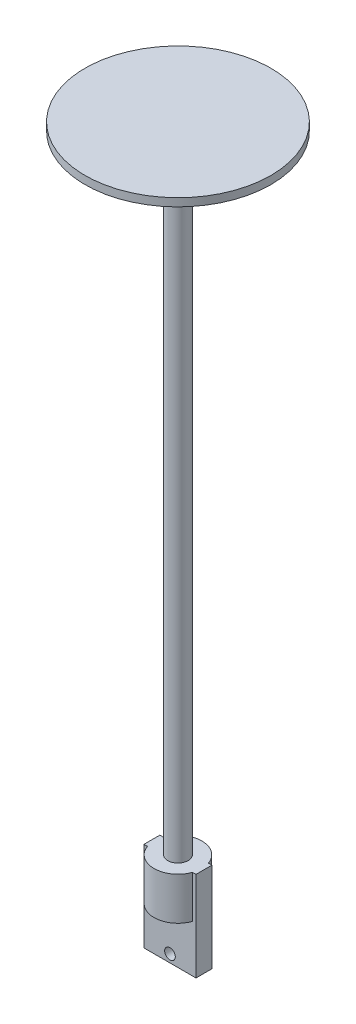
ISO-10303-21;
HEADER;
FILE_DESCRIPTION(('STEP AP214'),'2;1');
FILE_NAME('part.step','',(''),(''),'','','');
FILE_SCHEMA(('AUTOMOTIVE_DESIGN { 1 0 10303 214 1 1 1 1 }'));
ENDSEC;
DATA;
#1=APPLICATION_CONTEXT('core data for automotive mechanical design processes');
#2=APPLICATION_PROTOCOL_DEFINITION('international standard','automotive_design',2000,#1);
#3=PRODUCT_CONTEXT('',#1,'mechanical');
#4=PRODUCT('Part','Part','',(#3));
#5=PRODUCT_RELATED_PRODUCT_CATEGORY('part','',(#4));
#6=PRODUCT_DEFINITION_FORMATION('','',#4);
#7=PRODUCT_DEFINITION_CONTEXT('part definition',#1,'design');
#8=PRODUCT_DEFINITION('design','',#6,#7);
#9=PRODUCT_DEFINITION_SHAPE('','',#8);
#10=(LENGTH_UNIT() NAMED_UNIT(*) SI_UNIT(.MILLI.,.METRE.));
#11=(NAMED_UNIT(*) PLANE_ANGLE_UNIT() SI_UNIT($,.RADIAN.));
#12=(NAMED_UNIT(*) SI_UNIT($,.STERADIAN.) SOLID_ANGLE_UNIT());
#13=UNCERTAINTY_MEASURE_WITH_UNIT(LENGTH_MEASURE(1.E-05),#10,'distance_accuracy_value','');
#14=(GEOMETRIC_REPRESENTATION_CONTEXT(3) GLOBAL_UNCERTAINTY_ASSIGNED_CONTEXT((#13)) GLOBAL_UNIT_ASSIGNED_CONTEXT((#10,
#11,#12)) REPRESENTATION_CONTEXT('',''));
#15=CARTESIAN_POINT('',(0.,0.,0.));
#16=DIRECTION('',(0.,0.,1.));
#17=DIRECTION('',(1.,0.,0.));
#18=AXIS2_PLACEMENT_3D('',#15,#16,#17);
#19=CARTESIAN_POINT('',(0.,130.45,1.5));
#20=DIRECTION('',(0.,-1.,0.));
#21=DIRECTION('',(0.,0.,-1.));
#22=AXIS2_PLACEMENT_3D('',#19,#20,#21);
#23=CYLINDRICAL_SURFACE('',#22,1.925);
#24=CARTESIAN_POINT('',(0.,122.65,1.5));
#25=DIRECTION('',(0.,-1.,0.));
#26=DIRECTION('',(1.,0.,0.));
#27=AXIS2_PLACEMENT_3D('',#24,#25,#26);
#28=CIRCLE('',#27,1.925);
#29=CARTESIAN_POINT('',(0.,122.65,-0.425));
#30=VERTEX_POINT('',#29);
#31=EDGE_CURVE('E128',#30,#30,#28,.T.);
#32=CARTESIAN_POINT('',(0.,12.45,1.5));
#33=DIRECTION('',(0.,1.,0.));
#34=DIRECTION('',(0.,0.,1.));
#35=AXIS2_PLACEMENT_3D('',#32,#33,#34);
#36=CIRCLE('',#35,1.925);
#37=CARTESIAN_POINT('',(0.,12.45,-0.425));
#38=VERTEX_POINT('',#37);
#39=EDGE_CURVE('E127',#38,#38,#36,.T.);
#40=CARTESIAN_POINT('',(0.,122.65,-0.425));
#41=CARTESIAN_POINT('',(0.,121.502083333333,-0.425));
#42=CARTESIAN_POINT('',(0.,120.354166666667,-0.425));
#43=CARTESIAN_POINT('',(0.,118.058333333333,-0.425));
#44=CARTESIAN_POINT('',(0.,116.910416666667,-0.425));
#45=CARTESIAN_POINT('',(0.,114.614583333333,-0.425));
#46=CARTESIAN_POINT('',(0.,113.466666666667,-0.425));
#47=CARTESIAN_POINT('',(0.,111.170833333333,-0.425));
#48=CARTESIAN_POINT('',(0.,110.022916666667,-0.425));
#49=CARTESIAN_POINT('',(0.,107.727083333333,-0.425));
#50=CARTESIAN_POINT('',(0.,106.579166666667,-0.425));
#51=CARTESIAN_POINT('',(0.,104.283333333333,-0.425));
#52=CARTESIAN_POINT('',(0.,103.135416666667,-0.425));
#53=CARTESIAN_POINT('',(0.,100.839583333333,-0.425));
#54=CARTESIAN_POINT('',(0.,99.6916666666667,-0.425));
#55=CARTESIAN_POINT('',(0.,97.3958333333333,-0.425));
#56=CARTESIAN_POINT('',(0.,96.2479166666667,-0.425));
#57=CARTESIAN_POINT('',(0.,93.9520833333333,-0.425));
#58=CARTESIAN_POINT('',(0.,92.8041666666667,-0.425));
#59=CARTESIAN_POINT('',(0.,90.5083333333333,-0.425));
#60=CARTESIAN_POINT('',(0.,89.3604166666667,-0.425));
#61=CARTESIAN_POINT('',(0.,87.0645833333333,-0.425));
#62=CARTESIAN_POINT('',(0.,85.9166666666667,-0.425));
#63=CARTESIAN_POINT('',(0.,83.6208333333333,-0.425));
#64=CARTESIAN_POINT('',(0.,82.4729166666667,-0.425));
#65=CARTESIAN_POINT('',(0.,80.1770833333333,-0.425));
#66=CARTESIAN_POINT('',(0.,79.0291666666667,-0.425));
#67=CARTESIAN_POINT('',(0.,76.7333333333333,-0.425));
#68=CARTESIAN_POINT('',(0.,75.5854166666667,-0.425));
#69=CARTESIAN_POINT('',(0.,73.2895833333333,-0.425));
#70=CARTESIAN_POINT('',(0.,72.1416666666667,-0.425));
#71=CARTESIAN_POINT('',(0.,69.8458333333333,-0.425));
#72=CARTESIAN_POINT('',(0.,68.6979166666667,-0.425));
#73=CARTESIAN_POINT('',(0.,66.4020833333334,-0.425));
#74=CARTESIAN_POINT('',(0.,65.2541666666667,-0.425));
#75=CARTESIAN_POINT('',(0.,62.9583333333333,-0.425));
#76=CARTESIAN_POINT('',(0.,61.8104166666667,-0.425));
#77=CARTESIAN_POINT('',(0.,59.5145833333333,-0.425));
#78=CARTESIAN_POINT('',(0.,58.3666666666667,-0.425));
#79=CARTESIAN_POINT('',(0.,56.0708333333333,-0.425));
#80=CARTESIAN_POINT('',(0.,54.9229166666667,-0.425));
#81=CARTESIAN_POINT('',(0.,52.6270833333333,-0.425));
#82=CARTESIAN_POINT('',(0.,51.4791666666667,-0.425));
#83=CARTESIAN_POINT('',(0.,49.1833333333333,-0.425));
#84=CARTESIAN_POINT('',(0.,48.0354166666667,-0.425));
#85=CARTESIAN_POINT('',(0.,45.7395833333333,-0.425));
#86=CARTESIAN_POINT('',(0.,44.5916666666667,-0.425));
#87=CARTESIAN_POINT('',(0.,42.2958333333333,-0.425));
#88=CARTESIAN_POINT('',(0.,41.1479166666667,-0.425));
#89=CARTESIAN_POINT('',(0.,38.8520833333333,-0.425));
#90=CARTESIAN_POINT('',(0.,37.7041666666667,-0.425));
#91=CARTESIAN_POINT('',(0.,35.4083333333333,-0.425));
#92=CARTESIAN_POINT('',(0.,34.2604166666667,-0.425));
#93=CARTESIAN_POINT('',(0.,31.9645833333333,-0.425));
#94=CARTESIAN_POINT('',(0.,30.8166666666667,-0.425));
#95=CARTESIAN_POINT('',(0.,28.5208333333333,-0.425));
#96=CARTESIAN_POINT('',(0.,27.3729166666667,-0.425));
#97=CARTESIAN_POINT('',(0.,25.0770833333333,-0.425));
#98=CARTESIAN_POINT('',(0.,23.9291666666667,-0.425));
#99=CARTESIAN_POINT('',(0.,21.6333333333333,-0.425));
#100=CARTESIAN_POINT('',(0.,20.4854166666667,-0.425));
#101=CARTESIAN_POINT('',(0.,18.1895833333333,-0.425));
#102=CARTESIAN_POINT('',(0.,17.0416666666667,-0.425));
#103=CARTESIAN_POINT('',(0.,14.7458333333333,-0.425));
#104=CARTESIAN_POINT('',(0.,13.5979166666667,-0.425));
#105=CARTESIAN_POINT('',(0.,12.45,-0.425));
#106=B_SPLINE_CURVE_WITH_KNOTS('',3,(#40,#41,#42,#43,#44,#45,#46,#47,#48,#49,#50,#51,#52,#53,
#54,#55,#56,#57,#58,#59,#60,#61,#62,#63,#64,#65,#66,#67,#68,#69,#70,#71,#72,#73,#74,#75,#76,#77,
#78,#79,#80,#81,#82,#83,#84,#85,#86,#87,#88,#89,#90,#91,#92,#93,#94,#95,#96,#97,#98,#99,#100,
#101,#102,#103,#104,#105),.UNSPECIFIED.,.F.,.F.,(4,2,2,2,2,2,2,2,2,2,2,2,2,2,2,2,2,2,2,2,2,2,2,
2,2,2,2,2,2,2,2,2,4),(0.,3.44375,6.88749999999999,10.33125,13.775,17.21875,20.6625,24.10625,
27.55,30.99375,34.4375,37.88125,41.325,44.76875,48.2125,51.65625,55.1,58.54375,61.9875,65.43125,
68.875,72.31875,75.7625,79.20625,82.65,86.09375,89.5375,92.98125,96.425,99.86875,103.3125,
106.75625,110.2),.UNSPECIFIED.);
#107=EDGE_CURVE('BSEAM47',#30,#38,#106,.T.);
#108=ORIENTED_EDGE('',*,*,#31,.T.);
#109=ORIENTED_EDGE('',*,*,#39,.T.);
#110=ORIENTED_EDGE('',*,*,#107,.T.);
#111=ORIENTED_EDGE('',*,*,#107,.F.);
#112=EDGE_LOOP('',(#108,#110,#109,#111));
#113=FACE_BOUND('',#112,.T.);
#114=ADVANCED_FACE('F47',(#113),#23,.T.);
#115=CARTESIAN_POINT('',(0.,123.05,1.5));
#116=DIRECTION('',(0.,1.,0.));
#117=DIRECTION('',(-1.,0.,0.));
#118=AXIS2_PLACEMENT_3D('',#115,#116,#117);
#119=CONICAL_SURFACE('',#118,3.23094010767584,0.5235987755983);
#120=CARTESIAN_POINT('',(0.,129.45,1.5));
#121=DIRECTION('',(0.,-1.,0.));
#122=DIRECTION('',(1.,0.,0.));
#123=AXIS2_PLACEMENT_3D('',#120,#121,#122);
#124=CIRCLE('',#123,6.92598183048947);
#125=CARTESIAN_POINT('',(6.92598183048947,129.45,1.5));
#126=VERTEX_POINT('',#125);
#127=EDGE_CURVE('E132',#126,#126,#124,.T.);
#128=ORIENTED_EDGE('',*,*,#127,.T.);
#129=EDGE_LOOP('',(#128));
#130=FACE_BOUND('',#129,.T.);
#131=CARTESIAN_POINT('',(0.,123.05,1.5));
#132=DIRECTION('',(0.,-1.,0.));
#133=DIRECTION('',(1.,0.,0.));
#134=AXIS2_PLACEMENT_3D('',#131,#132,#133);
#135=CIRCLE('',#134,3.23094010767584);
#136=CARTESIAN_POINT('',(3.23094010767584,123.05,1.5));
#137=VERTEX_POINT('',#136);
#138=EDGE_CURVE('E11',#137,#137,#135,.T.);
#139=ORIENTED_EDGE('',*,*,#138,.F.);
#140=EDGE_LOOP('',(#139));
#141=FACE_BOUND('',#140,.T.);
#142=ADVANCED_FACE('F161',(#130,#141),#119,.T.);
#143=CARTESIAN_POINT('',(0.,128.45,1.5));
#144=DIRECTION('',(0.,-1.,0.));
#145=DIRECTION('',(1.,0.,0.));
#146=AXIS2_PLACEMENT_3D('',#143,#144,#145);
#147=TOROIDAL_SURFACE('',#146,8.65803263805835,2.);
#148=CARTESIAN_POINT('',(0.,130.45,1.5));
#149=DIRECTION('',(0.,-1.,0.));
#150=DIRECTION('',(1.,0.,0.));
#151=AXIS2_PLACEMENT_3D('',#148,#149,#150);
#152=CIRCLE('',#151,8.65803263805836);
#153=CARTESIAN_POINT('',(8.65803263805836,130.45,1.5));
#154=VERTEX_POINT('',#153);
#155=EDGE_CURVE('E131',#154,#154,#152,.T.);
#156=ORIENTED_EDGE('',*,*,#155,.T.);
#157=EDGE_LOOP('',(#156));
#158=FACE_BOUND('',#157,.T.);
#159=ORIENTED_EDGE('',*,*,#127,.F.);
#160=EDGE_LOOP('',(#159));
#161=FACE_BOUND('',#160,.T.);
#162=ADVANCED_FACE('F162',(#158,#161),#147,.F.);
#163=CARTESIAN_POINT('',(0.,130.45,1.5));
#164=DIRECTION('',(0.,1.,0.));
#165=DIRECTION('',(-1.,0.,0.));
#166=AXIS2_PLACEMENT_3D('',#163,#164,#165);
#167=PLANE('',#166);
#168=ORIENTED_EDGE('',*,*,#155,.F.);
#169=EDGE_LOOP('',(#168));
#170=FACE_BOUND('',#169,.T.);
#171=CARTESIAN_POINT('',(0.,130.45,1.5));
#172=DIRECTION('',(0.,-1.,0.));
#173=DIRECTION('',(1.,0.,0.));
#174=AXIS2_PLACEMENT_3D('',#171,#172,#173);
#175=CIRCLE('',#174,17.5);
#176=CARTESIAN_POINT('',(17.5,130.45,1.5));
#177=VERTEX_POINT('',#176);
#178=EDGE_CURVE('E140',#177,#177,#175,.T.);
#179=ORIENTED_EDGE('',*,*,#178,.T.);
#180=EDGE_LOOP('',(#179));
#181=FACE_BOUND('',#180,.T.);
#182=ADVANCED_FACE('F166',(#170,#181),#167,.F.);
#183=CARTESIAN_POINT('',(0.,130.45,1.5));
#184=DIRECTION('',(0.,-1.,0.));
#185=DIRECTION('',(1.,0.,0.));
#186=AXIS2_PLACEMENT_3D('',#183,#184,#185);
#187=CYLINDRICAL_SURFACE('',#186,17.5);
#188=ORIENTED_EDGE('',*,*,#178,.F.);
#189=EDGE_LOOP('',(#188));
#190=FACE_BOUND('',#189,.T.);
#191=CARTESIAN_POINT('',(0.,131.95,1.5));
#192=DIRECTION('',(0.,-1.,0.));
#193=DIRECTION('',(1.,0.,0.));
#194=AXIS2_PLACEMENT_3D('',#191,#192,#193);
#195=CIRCLE('',#194,17.5);
#196=CARTESIAN_POINT('',(17.5,131.95,1.5));
#197=VERTEX_POINT('',#196);
#198=EDGE_CURVE('E141',#197,#197,#195,.T.);
#199=ORIENTED_EDGE('',*,*,#198,.T.);
#200=EDGE_LOOP('',(#199));
#201=FACE_BOUND('',#200,.T.);
#202=ADVANCED_FACE('F180',(#190,#201),#187,.T.);
#203=CARTESIAN_POINT('',(0.,131.95,1.5));
#204=DIRECTION('',(0.,-1.,0.));
#205=DIRECTION('',(1.,0.,0.));
#206=AXIS2_PLACEMENT_3D('',#203,#204,#205);
#207=PLANE('',#206);
#208=ORIENTED_EDGE('',*,*,#198,.F.);
#209=EDGE_LOOP('',(#208));
#210=FACE_BOUND('',#209,.T.);
#211=ADVANCED_FACE('F181',(#210),#207,.F.);
#212=CARTESIAN_POINT('',(0.,122.65,1.5));
#213=DIRECTION('',(0.,-1.,0.));
#214=DIRECTION('',(1.,0.,0.));
#215=AXIS2_PLACEMENT_3D('',#212,#213,#214);
#216=PLANE('',#215);
#217=CARTESIAN_POINT('',(0.,122.65,1.5));
#218=DIRECTION('',(0.,-1.,0.));
#219=DIRECTION('',(1.,0.,0.));
#220=AXIS2_PLACEMENT_3D('',#217,#218,#219);
#221=CIRCLE('',#220,2.5381197846483);
#222=CARTESIAN_POINT('',(2.5381197846483,122.65,1.5));
#223=VERTEX_POINT('',#222);
#224=EDGE_CURVE('E59',#223,#223,#221,.T.);
#225=ORIENTED_EDGE('',*,*,#224,.T.);
#226=EDGE_LOOP('',(#225));
#227=FACE_BOUND('',#226,.T.);
#228=ORIENTED_EDGE('',*,*,#31,.F.);
#229=EDGE_LOOP('',(#228));
#230=FACE_BOUND('',#229,.T.);
#231=ADVANCED_FACE('F153',(#227,#230),#216,.T.);
#232=CARTESIAN_POINT('',(0.,123.45,1.5));
#233=DIRECTION('',(0.,-1.,0.));
#234=DIRECTION('',(1.,0.,0.));
#235=AXIS2_PLACEMENT_3D('',#232,#233,#234);
#236=TOROIDAL_SURFACE('',#235,2.5381197846483,0.8);
#237=ORIENTED_EDGE('',*,*,#224,.F.);
#238=EDGE_LOOP('',(#237));
#239=FACE_BOUND('',#238,.T.);
#240=ORIENTED_EDGE('',*,*,#138,.T.);
#241=EDGE_LOOP('',(#240));
#242=FACE_BOUND('',#241,.T.);
#243=ADVANCED_FACE('F51',(#239,#242),#236,.T.);
#244=CARTESIAN_POINT('',(0.,-2.95,3.));
#245=DIRECTION('',(0.,0.,-1.));
#246=DIRECTION('',(-1.,0.,0.));
#247=AXIS2_PLACEMENT_3D('',#244,#245,#246);
#248=CYLINDRICAL_SURFACE('',#247,1.);
#249=CARTESIAN_POINT('',(0.,-2.95,3.));
#250=DIRECTION('',(0.,0.,1.));
#251=DIRECTION('',(1.,0.,0.));
#252=AXIS2_PLACEMENT_3D('',#249,#250,#251);
#253=CIRCLE('',#252,1.);
#254=CARTESIAN_POINT('',(1.,-2.95,3.));
#255=VERTEX_POINT('',#254);
#256=EDGE_CURVE('E331',#255,#255,#253,.T.);
#257=ORIENTED_EDGE('',*,*,#256,.T.);
#258=EDGE_LOOP('',(#257));
#259=FACE_BOUND('',#258,.T.);
#260=CARTESIAN_POINT('',(0.,-2.95,0.));
#261=DIRECTION('',(0.,0.,1.));
#262=DIRECTION('',(1.,0.,0.));
#263=AXIS2_PLACEMENT_3D('',#260,#261,#262);
#264=CIRCLE('',#263,1.);
#265=CARTESIAN_POINT('',(1.,-2.95,0.));
#266=VERTEX_POINT('',#265);
#267=EDGE_CURVE('E327',#266,#266,#264,.T.);
#268=ORIENTED_EDGE('',*,*,#267,.F.);
#269=EDGE_LOOP('',(#268));
#270=FACE_BOUND('',#269,.T.);
#271=ADVANCED_FACE('F158',(#259,#270),#248,.F.);
#272=CARTESIAN_POINT('',(4.9,-4.45,3.));
#273=DIRECTION('',(0.,1.,0.));
#274=DIRECTION('',(-1.,0.,0.));
#275=AXIS2_PLACEMENT_3D('',#272,#273,#274);
#276=PLANE('',#275);
#277=DIRECTION('',(1.,0.,0.));
#278=VECTOR('',#277,1.);
#279=CARTESIAN_POINT('',(4.9,-4.45,0.));
#280=LINE('',#279,#278);
#281=CARTESIAN_POINT('',(-4.9,-4.45,0.));
#282=VERTEX_POINT('',#281);
#283=CARTESIAN_POINT('',(4.9,-4.45,0.));
#284=VERTEX_POINT('',#283);
#285=EDGE_CURVE('E87',#282,#284,#280,.T.);
#286=ORIENTED_EDGE('',*,*,#285,.T.);
#287=DIRECTION('',(0.,0.,-1.));
#288=VECTOR('',#287,1.);
#289=CARTESIAN_POINT('',(4.9,-4.45,3.));
#290=LINE('',#289,#288);
#291=CARTESIAN_POINT('',(4.9,-4.45,3.));
#292=VERTEX_POINT('',#291);
#293=EDGE_CURVE('E89',#292,#284,#290,.T.);
#294=ORIENTED_EDGE('',*,*,#293,.F.);
#295=DIRECTION('',(1.,0.,0.));
#296=VECTOR('',#295,1.);
#297=CARTESIAN_POINT('',(4.9,-4.45,3.));
#298=LINE('',#297,#296);
#299=CARTESIAN_POINT('',(-4.9,-4.45,3.));
#300=VERTEX_POINT('',#299);
#301=EDGE_CURVE('E74',#300,#292,#298,.T.);
#302=ORIENTED_EDGE('',*,*,#301,.F.);
#303=DIRECTION('',(0.,0.,-1.));
#304=VECTOR('',#303,1.);
#305=CARTESIAN_POINT('',(-4.9,-4.45,3.));
#306=LINE('',#305,#304);
#307=EDGE_CURVE('E91',#300,#282,#306,.T.);
#308=ORIENTED_EDGE('',*,*,#307,.T.);
#309=EDGE_LOOP('',(#286,#294,#302,#308));
#310=FACE_BOUND('',#309,.T.);
#311=ADVANCED_FACE('F90',(#310),#276,.F.);
#312=CARTESIAN_POINT('',(0.,4.45,1.5));
#313=DIRECTION('',(0.,1.,0.));
#314=DIRECTION('',(0.,0.,1.));
#315=AXIS2_PLACEMENT_3D('',#312,#313,#314);
#316=PLANE('',#315);
#317=CARTESIAN_POINT('',(0.,4.45,1.5));
#318=DIRECTION('',(0.,1.,0.));
#319=DIRECTION('',(0.,0.,1.));
#320=AXIS2_PLACEMENT_3D('',#317,#318,#319);
#321=CIRCLE('',#320,4.5);
#322=CARTESIAN_POINT('',(4.24264068711929,4.45,0.));
#323=VERTEX_POINT('',#322);
#324=CARTESIAN_POINT('',(-4.24264068711928,4.45,0.));
#325=VERTEX_POINT('',#324);
#326=EDGE_CURVE('E326',#323,#325,#321,.T.);
#327=ORIENTED_EDGE('',*,*,#326,.F.);
#328=DIRECTION('',(-1.,0.,0.));
#329=VECTOR('',#328,1.);
#330=CARTESIAN_POINT('',(4.9,4.45,0.));
#331=LINE('',#330,#329);
#332=EDGE_CURVE('E117',#323,#325,#331,.T.);
#333=ORIENTED_EDGE('',*,*,#332,.T.);
#334=EDGE_LOOP('',(#327,#333));
#335=FACE_BOUND('',#334,.T.);
#336=ADVANCED_FACE('F220',(#335),#316,.F.);
#337=DIRECTION('',(-1.,0.,0.));
#338=VECTOR('',#337,1.);
#339=CARTESIAN_POINT('',(4.9,4.45,3.));
#340=LINE('',#339,#338);
#341=CARTESIAN_POINT('',(4.24264068711929,4.45,3.));
#342=VERTEX_POINT('',#341);
#343=CARTESIAN_POINT('',(-4.24264068711928,4.45,3.));
#344=VERTEX_POINT('',#343);
#345=EDGE_CURVE('E107',#342,#344,#340,.T.);
#346=ORIENTED_EDGE('',*,*,#345,.F.);
#347=CARTESIAN_POINT('',(0.,4.45,1.5));
#348=DIRECTION('',(0.,1.,0.));
#349=DIRECTION('',(0.,0.,1.));
#350=AXIS2_PLACEMENT_3D('',#347,#348,#349);
#351=CIRCLE('',#350,4.5);
#352=EDGE_CURVE('E374',#344,#342,#351,.T.);
#353=ORIENTED_EDGE('',*,*,#352,.F.);
#354=EDGE_LOOP('',(#346,#353));
#355=FACE_BOUND('',#354,.T.);
#356=ADVANCED_FACE('F221',(#355),#316,.F.);
#357=CARTESIAN_POINT('',(0.,14.45,1.5));
#358=DIRECTION('',(0.,-1.,0.));
#359=DIRECTION('',(0.,0.,-1.));
#360=AXIS2_PLACEMENT_3D('',#357,#358,#359);
#361=CYLINDRICAL_SURFACE('',#360,4.5);
#362=CARTESIAN_POINT('',(0.,12.45,1.5));
#363=DIRECTION('',(0.,1.,0.));
#364=DIRECTION('',(0.,0.,1.));
#365=AXIS2_PLACEMENT_3D('',#362,#363,#364);
#366=CIRCLE('',#365,4.5);
#367=CARTESIAN_POINT('',(4.24264068711929,12.45,0.));
#368=VERTEX_POINT('',#367);
#369=CARTESIAN_POINT('',(-4.24264068711928,12.45,0.));
#370=VERTEX_POINT('',#369);
#371=EDGE_CURVE('E301',#368,#370,#366,.T.);
#372=ORIENTED_EDGE('',*,*,#371,.F.);
#373=DIRECTION('',(0.,-1.,0.));
#374=VECTOR('',#373,1.);
#375=CARTESIAN_POINT('',(4.24264068711929,14.45,0.));
#376=LINE('',#375,#374);
#377=EDGE_CURVE('E377',#368,#323,#376,.T.);
#378=ORIENTED_EDGE('',*,*,#377,.T.);
#379=ORIENTED_EDGE('',*,*,#326,.T.);
#380=DIRECTION('',(0.,-1.,0.));
#381=VECTOR('',#380,1.);
#382=CARTESIAN_POINT('',(-4.24264068711928,14.45,0.));
#383=LINE('',#382,#381);
#384=EDGE_CURVE('E319',#370,#325,#383,.T.);
#385=ORIENTED_EDGE('',*,*,#384,.F.);
#386=EDGE_LOOP('',(#372,#378,#379,#385));
#387=FACE_BOUND('',#386,.T.);
#388=ADVANCED_FACE('F234',(#387),#361,.T.);
#389=CARTESIAN_POINT('',(-4.9,-4.45,3.));
#390=DIRECTION('',(1.,0.,0.));
#391=DIRECTION('',(0.,0.,-1.));
#392=AXIS2_PLACEMENT_3D('',#389,#390,#391);
#393=PLANE('',#392);
#394=DIRECTION('',(0.,0.,1.));
#395=VECTOR('',#394,1.);
#396=CARTESIAN_POINT('',(-4.9,12.45,0.));
#397=LINE('',#396,#395);
#398=CARTESIAN_POINT('',(-4.9,12.45,0.));
#399=VERTEX_POINT('',#398);
#400=CARTESIAN_POINT('',(-4.9,12.45,3.));
#401=VERTEX_POINT('',#400);
#402=EDGE_CURVE('E325',#399,#401,#397,.T.);
#403=ORIENTED_EDGE('',*,*,#402,.F.);
#404=DIRECTION('',(0.,-1.,0.));
#405=VECTOR('',#404,1.);
#406=CARTESIAN_POINT('',(-4.9,-4.45,0.));
#407=LINE('',#406,#405);
#408=EDGE_CURVE('E97',#399,#282,#407,.T.);
#409=ORIENTED_EDGE('',*,*,#408,.T.);
#410=ORIENTED_EDGE('',*,*,#307,.F.);
#411=DIRECTION('',(0.,-1.,0.));
#412=VECTOR('',#411,1.);
#413=CARTESIAN_POINT('',(-4.9,-4.45,3.));
#414=LINE('',#413,#412);
#415=EDGE_CURVE('E116',#401,#300,#414,.T.);
#416=ORIENTED_EDGE('',*,*,#415,.F.);
#417=EDGE_LOOP('',(#403,#409,#410,#416));
#418=FACE_BOUND('',#417,.T.);
#419=ADVANCED_FACE('F238',(#418),#393,.F.);
#420=CARTESIAN_POINT('',(4.9,-4.45,3.));
#421=DIRECTION('',(-1.,0.,0.));
#422=DIRECTION('',(0.,0.,1.));
#423=AXIS2_PLACEMENT_3D('',#420,#421,#422);
#424=PLANE('',#423);
#425=DIRECTION('',(0.,0.,-1.));
#426=VECTOR('',#425,1.);
#427=CARTESIAN_POINT('',(4.9,12.45,3.));
#428=LINE('',#427,#426);
#429=CARTESIAN_POINT('',(4.9,12.45,3.));
#430=VERTEX_POINT('',#429);
#431=CARTESIAN_POINT('',(4.9,12.45,0.));
#432=VERTEX_POINT('',#431);
#433=EDGE_CURVE('E366',#430,#432,#428,.T.);
#434=ORIENTED_EDGE('',*,*,#433,.F.);
#435=DIRECTION('',(0.,1.,0.));
#436=VECTOR('',#435,1.);
#437=CARTESIAN_POINT('',(4.9,-4.45,3.));
#438=LINE('',#437,#436);
#439=EDGE_CURVE('E106',#292,#430,#438,.T.);
#440=ORIENTED_EDGE('',*,*,#439,.F.);
#441=ORIENTED_EDGE('',*,*,#293,.T.);
#442=DIRECTION('',(0.,1.,0.));
#443=VECTOR('',#442,1.);
#444=CARTESIAN_POINT('',(4.9,-4.45,0.));
#445=LINE('',#444,#443);
#446=EDGE_CURVE('E98',#284,#432,#445,.T.);
#447=ORIENTED_EDGE('',*,*,#446,.T.);
#448=EDGE_LOOP('',(#434,#440,#441,#447));
#449=FACE_BOUND('',#448,.T.);
#450=ADVANCED_FACE('F102',(#449),#424,.F.);
#451=CARTESIAN_POINT('',(0.,0.,0.));
#452=DIRECTION('',(0.,0.,1.));
#453=DIRECTION('',(1.,0.,0.));
#454=AXIS2_PLACEMENT_3D('',#451,#452,#453);
#455=PLANE('',#454);
#456=ORIENTED_EDGE('',*,*,#267,.T.);
#457=EDGE_LOOP('',(#456));
#458=FACE_BOUND('',#457,.T.);
#459=DIRECTION('',(-1.,0.,0.));
#460=VECTOR('',#459,1.);
#461=CARTESIAN_POINT('',(4.9,12.45,0.));
#462=LINE('',#461,#460);
#463=EDGE_CURVE('E111',#432,#368,#462,.T.);
#464=ORIENTED_EDGE('',*,*,#463,.F.);
#465=ORIENTED_EDGE('',*,*,#446,.F.);
#466=ORIENTED_EDGE('',*,*,#285,.F.);
#467=ORIENTED_EDGE('',*,*,#408,.F.);
#468=DIRECTION('',(-1.,0.,0.));
#469=VECTOR('',#468,1.);
#470=CARTESIAN_POINT('',(-4.24264068711928,12.45,0.));
#471=LINE('',#470,#469);
#472=EDGE_CURVE('E306',#370,#399,#471,.T.);
#473=ORIENTED_EDGE('',*,*,#472,.F.);
#474=ORIENTED_EDGE('',*,*,#384,.T.);
#475=ORIENTED_EDGE('',*,*,#332,.F.);
#476=ORIENTED_EDGE('',*,*,#377,.F.);
#477=EDGE_LOOP('',(#464,#465,#466,#467,#473,#474,#475,#476));
#478=FACE_BOUND('',#477,.T.);
#479=ADVANCED_FACE('F112',(#458,#478),#455,.F.);
#480=CARTESIAN_POINT('',(0.,14.45,1.5));
#481=DIRECTION('',(0.,-1.,0.));
#482=DIRECTION('',(0.,0.,-1.));
#483=AXIS2_PLACEMENT_3D('',#480,#481,#482);
#484=CYLINDRICAL_SURFACE('',#483,4.5);
#485=CARTESIAN_POINT('',(0.,12.45,1.5));
#486=DIRECTION('',(0.,1.,0.));
#487=DIRECTION('',(0.,0.,1.));
#488=AXIS2_PLACEMENT_3D('',#485,#486,#487);
#489=CIRCLE('',#488,4.5);
#490=CARTESIAN_POINT('',(-4.24264068711928,12.45,3.));
#491=VERTEX_POINT('',#490);
#492=CARTESIAN_POINT('',(4.24264068711928,12.45,3.));
#493=VERTEX_POINT('',#492);
#494=EDGE_CURVE('E360',#491,#493,#489,.T.);
#495=ORIENTED_EDGE('',*,*,#494,.F.);
#496=DIRECTION('',(0.,-1.,0.));
#497=VECTOR('',#496,1.);
#498=CARTESIAN_POINT('',(-4.24264068711928,14.45,3.));
#499=LINE('',#498,#497);
#500=EDGE_CURVE('E328',#491,#344,#499,.T.);
#501=ORIENTED_EDGE('',*,*,#500,.T.);
#502=ORIENTED_EDGE('',*,*,#352,.T.);
#503=DIRECTION('',(0.,-1.,0.));
#504=VECTOR('',#503,1.);
#505=CARTESIAN_POINT('',(4.24264068711929,14.45,3.));
#506=LINE('',#505,#504);
#507=EDGE_CURVE('E340',#493,#342,#506,.T.);
#508=ORIENTED_EDGE('',*,*,#507,.F.);
#509=EDGE_LOOP('',(#495,#501,#502,#508));
#510=FACE_BOUND('',#509,.T.);
#511=ADVANCED_FACE('F265',(#510),#484,.T.);
#512=CARTESIAN_POINT('',(0.,0.,3.));
#513=DIRECTION('',(0.,0.,1.));
#514=DIRECTION('',(1.,0.,0.));
#515=AXIS2_PLACEMENT_3D('',#512,#513,#514);
#516=PLANE('',#515);
#517=DIRECTION('',(1.,0.,0.));
#518=VECTOR('',#517,1.);
#519=CARTESIAN_POINT('',(4.24264068711928,12.45,3.));
#520=LINE('',#519,#518);
#521=EDGE_CURVE('E365',#493,#430,#520,.T.);
#522=ORIENTED_EDGE('',*,*,#521,.F.);
#523=ORIENTED_EDGE('',*,*,#507,.T.);
#524=ORIENTED_EDGE('',*,*,#345,.T.);
#525=ORIENTED_EDGE('',*,*,#500,.F.);
#526=DIRECTION('',(1.,0.,0.));
#527=VECTOR('',#526,1.);
#528=CARTESIAN_POINT('',(-4.9,12.45,3.));
#529=LINE('',#528,#527);
#530=EDGE_CURVE('E61',#401,#491,#529,.T.);
#531=ORIENTED_EDGE('',*,*,#530,.F.);
#532=ORIENTED_EDGE('',*,*,#415,.T.);
#533=ORIENTED_EDGE('',*,*,#301,.T.);
#534=ORIENTED_EDGE('',*,*,#439,.T.);
#535=EDGE_LOOP('',(#522,#523,#524,#525,#531,#532,#533,#534));
#536=FACE_BOUND('',#535,.T.);
#537=ORIENTED_EDGE('',*,*,#256,.F.);
#538=EDGE_LOOP('',(#537));
#539=FACE_BOUND('',#538,.T.);
#540=ADVANCED_FACE('F275',(#536,#539),#516,.T.);
#541=CARTESIAN_POINT('',(0.,12.45,1.5));
#542=DIRECTION('',(0.,1.,0.));
#543=DIRECTION('',(0.,0.,1.));
#544=AXIS2_PLACEMENT_3D('',#541,#542,#543);
#545=PLANE('',#544);
#546=ORIENTED_EDGE('',*,*,#39,.F.);
#547=EDGE_LOOP('',(#546));
#548=FACE_BOUND('',#547,.T.);
#549=ORIENTED_EDGE('',*,*,#371,.T.);
#550=ORIENTED_EDGE('',*,*,#472,.T.);
#551=ORIENTED_EDGE('',*,*,#402,.T.);
#552=ORIENTED_EDGE('',*,*,#530,.T.);
#553=ORIENTED_EDGE('',*,*,#494,.T.);
#554=ORIENTED_EDGE('',*,*,#521,.T.);
#555=ORIENTED_EDGE('',*,*,#433,.T.);
#556=ORIENTED_EDGE('',*,*,#463,.T.);
#557=EDGE_LOOP('',(#549,#550,#551,#552,#553,#554,#555,#556));
#558=FACE_BOUND('',#557,.T.);
#559=ADVANCED_FACE('F285',(#548,#558),#545,.T.);
#560=CLOSED_SHELL('',(#114,#142,#162,#182,#202,#211,#231,#243,#271,#311,#336,#356,#388,#419,
#450,#479,#511,#540,#559));
#561=MANIFOLD_SOLID_BREP('B2',#560);
#562=ADVANCED_BREP_SHAPE_REPRESENTATION('',(#18,#561),#14);
#563=SHAPE_DEFINITION_REPRESENTATION(#9,#562);
ENDSEC;
END-ISO-10303-21;
